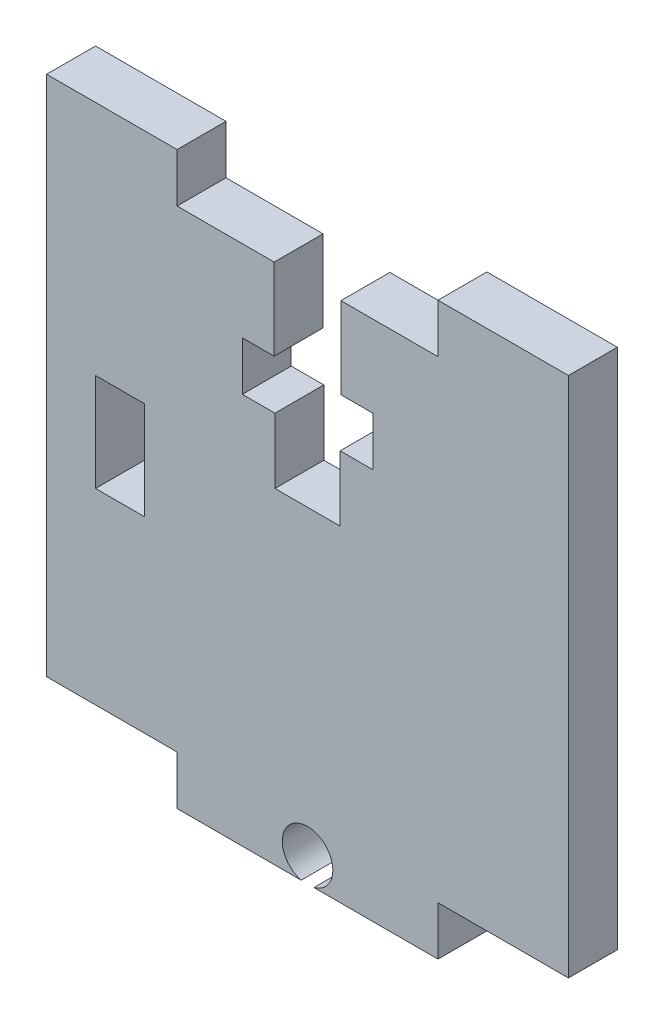
ISO-10303-21;
HEADER;
FILE_DESCRIPTION(('STEP AP214'),'2;1');
FILE_NAME('part.step','',(''),(''),'','','');
FILE_SCHEMA(('AUTOMOTIVE_DESIGN { 1 0 10303 214 1 1 1 1 }'));
ENDSEC;
DATA;
#1=APPLICATION_CONTEXT('core data for automotive mechanical design processes');
#2=APPLICATION_PROTOCOL_DEFINITION('international standard','automotive_design',2000,#1);
#3=PRODUCT_CONTEXT('',#1,'mechanical');
#4=PRODUCT('Part','Part','',(#3));
#5=PRODUCT_RELATED_PRODUCT_CATEGORY('part','',(#4));
#6=PRODUCT_DEFINITION_FORMATION('','',#4);
#7=PRODUCT_DEFINITION_CONTEXT('part definition',#1,'design');
#8=PRODUCT_DEFINITION('design','',#6,#7);
#9=PRODUCT_DEFINITION_SHAPE('','',#8);
#10=(LENGTH_UNIT() NAMED_UNIT(*) SI_UNIT(.MILLI.,.METRE.));
#11=(NAMED_UNIT(*) PLANE_ANGLE_UNIT() SI_UNIT($,.RADIAN.));
#12=(NAMED_UNIT(*) SI_UNIT($,.STERADIAN.) SOLID_ANGLE_UNIT());
#13=UNCERTAINTY_MEASURE_WITH_UNIT(LENGTH_MEASURE(1.E-05),#10,'distance_accuracy_value','');
#14=(GEOMETRIC_REPRESENTATION_CONTEXT(3) GLOBAL_UNCERTAINTY_ASSIGNED_CONTEXT((#13)) GLOBAL_UNIT_ASSIGNED_CONTEXT((#10,
#11,#12)) REPRESENTATION_CONTEXT('',''));
#15=CARTESIAN_POINT('',(0.,0.,0.));
#16=DIRECTION('',(0.,0.,1.));
#17=DIRECTION('',(1.,0.,0.));
#18=AXIS2_PLACEMENT_3D('',#15,#16,#17);
#19=CARTESIAN_POINT('',(0.,18.3553054771042,3.));
#20=DIRECTION('',(0.,0.,1.));
#21=DIRECTION('',(1.,0.,0.));
#22=AXIS2_PLACEMENT_3D('',#19,#20,#21);
#23=PLANE('',#22);
#24=DIRECTION('',(0.,-1.,0.));
#25=VECTOR('',#24,1.);
#26=CARTESIAN_POINT('',(8.,48.8553054771042,3.));
#27=LINE('',#26,#25);
#28=CARTESIAN_POINT('',(8.,51.8553054771042,3.));
#29=VERTEX_POINT('',#28);
#30=CARTESIAN_POINT('',(8.,48.8553054771042,3.));
#31=VERTEX_POINT('',#30);
#32=EDGE_CURVE('E266',#29,#31,#27,.T.);
#33=ORIENTED_EDGE('',*,*,#32,.T.);
#34=DIRECTION('',(-1.,0.,0.));
#35=VECTOR('',#34,1.);
#36=CARTESIAN_POINT('',(2.04789002341845,48.8553054771042,3.));
#37=LINE('',#36,#35);
#38=CARTESIAN_POINT('',(2.04789002341845,48.8553054771042,3.));
#39=VERTEX_POINT('',#38);
#40=EDGE_CURVE('E269',#31,#39,#37,.T.);
#41=ORIENTED_EDGE('',*,*,#40,.T.);
#42=DIRECTION('',(0.,-1.,0.));
#43=VECTOR('',#42,1.);
#44=CARTESIAN_POINT('',(2.04789002341845,48.8553054771042,3.));
#45=LINE('',#44,#43);
#46=CARTESIAN_POINT('',(2.04789002341845,43.8553054771042,3.));
#47=VERTEX_POINT('',#46);
#48=EDGE_CURVE('E272',#39,#47,#45,.T.);
#49=ORIENTED_EDGE('',*,*,#48,.T.);
#50=DIRECTION('',(1.,0.,0.));
#51=VECTOR('',#50,1.);
#52=CARTESIAN_POINT('',(2.04789002341845,43.8553054771042,3.));
#53=LINE('',#52,#51);
#54=CARTESIAN_POINT('',(4.,43.8553054771042,3.));
#55=VERTEX_POINT('',#54);
#56=EDGE_CURVE('E274',#47,#55,#53,.T.);
#57=ORIENTED_EDGE('',*,*,#56,.T.);
#58=DIRECTION('',(0.,-1.,0.));
#59=VECTOR('',#58,1.);
#60=CARTESIAN_POINT('',(4.,43.8553054771042,3.));
#61=LINE('',#60,#59);
#62=CARTESIAN_POINT('',(4.,40.8553054771042,3.));
#63=VERTEX_POINT('',#62);
#64=EDGE_CURVE('E276',#55,#63,#61,.T.);
#65=ORIENTED_EDGE('',*,*,#64,.T.);
#66=DIRECTION('',(-1.,0.,0.));
#67=VECTOR('',#66,1.);
#68=CARTESIAN_POINT('',(4.,40.8553054771042,3.));
#69=LINE('',#68,#67);
#70=CARTESIAN_POINT('',(2.,40.8553054771042,3.));
#71=VERTEX_POINT('',#70);
#72=EDGE_CURVE('E278',#63,#71,#69,.T.);
#73=ORIENTED_EDGE('',*,*,#72,.T.);
#74=DIRECTION('',(0.,-1.,0.));
#75=VECTOR('',#74,1.);
#76=CARTESIAN_POINT('',(2.,40.8553054771042,3.));
#77=LINE('',#76,#75);
#78=CARTESIAN_POINT('',(2.,36.8553054771042,3.));
#79=VERTEX_POINT('',#78);
#80=EDGE_CURVE('E280',#71,#79,#77,.T.);
#81=ORIENTED_EDGE('',*,*,#80,.T.);
#82=DIRECTION('',(-1.,0.,0.));
#83=VECTOR('',#82,1.);
#84=CARTESIAN_POINT('',(2.,36.8553054771042,3.));
#85=LINE('',#84,#83);
#86=CARTESIAN_POINT('',(-2.,36.8553054771042,3.));
#87=VERTEX_POINT('',#86);
#88=EDGE_CURVE('E282',#79,#87,#85,.T.);
#89=ORIENTED_EDGE('',*,*,#88,.T.);
#90=DIRECTION('',(0.,1.,0.));
#91=VECTOR('',#90,1.);
#92=CARTESIAN_POINT('',(-2.,40.8553054771042,3.));
#93=LINE('',#92,#91);
#94=CARTESIAN_POINT('',(-2.,40.8553054771042,3.));
#95=VERTEX_POINT('',#94);
#96=EDGE_CURVE('E284',#87,#95,#93,.T.);
#97=ORIENTED_EDGE('',*,*,#96,.T.);
#98=DIRECTION('',(-1.,0.,0.));
#99=VECTOR('',#98,1.);
#100=CARTESIAN_POINT('',(-4.00000000000001,40.8553054771042,3.));
#101=LINE('',#100,#99);
#102=CARTESIAN_POINT('',(-4.00000000000001,40.8553054771042,3.));
#103=VERTEX_POINT('',#102);
#104=EDGE_CURVE('E286',#95,#103,#101,.T.);
#105=ORIENTED_EDGE('',*,*,#104,.T.);
#106=DIRECTION('',(0.,1.,0.));
#107=VECTOR('',#106,1.);
#108=CARTESIAN_POINT('',(-4.,43.8553054771042,3.));
#109=LINE('',#108,#107);
#110=CARTESIAN_POINT('',(-4.,43.8553054771042,3.));
#111=VERTEX_POINT('',#110);
#112=EDGE_CURVE('E288',#103,#111,#109,.T.);
#113=ORIENTED_EDGE('',*,*,#112,.T.);
#114=DIRECTION('',(1.,0.,0.));
#115=VECTOR('',#114,1.);
#116=CARTESIAN_POINT('',(-2.04789002341846,43.8553054771042,3.));
#117=LINE('',#116,#115);
#118=CARTESIAN_POINT('',(-2.04789002341846,43.8553054771042,3.));
#119=VERTEX_POINT('',#118);
#120=EDGE_CURVE('E290',#111,#119,#117,.T.);
#121=ORIENTED_EDGE('',*,*,#120,.T.);
#122=DIRECTION('',(0.,1.,0.));
#123=VECTOR('',#122,1.);
#124=CARTESIAN_POINT('',(-2.04789002341846,48.8553054771042,3.));
#125=LINE('',#124,#123);
#126=CARTESIAN_POINT('',(-2.04789002341846,48.8553054771042,3.));
#127=VERTEX_POINT('',#126);
#128=EDGE_CURVE('E292',#119,#127,#125,.T.);
#129=ORIENTED_EDGE('',*,*,#128,.T.);
#130=DIRECTION('',(-1.,0.,0.));
#131=VECTOR('',#130,1.);
#132=CARTESIAN_POINT('',(-2.04789002341846,48.8553054771042,3.));
#133=LINE('',#132,#131);
#134=CARTESIAN_POINT('',(-8.00000000000001,48.8553054771042,3.));
#135=VERTEX_POINT('',#134);
#136=EDGE_CURVE('E294',#127,#135,#133,.T.);
#137=ORIENTED_EDGE('',*,*,#136,.T.);
#138=DIRECTION('',(0.,1.,0.));
#139=VECTOR('',#138,1.);
#140=CARTESIAN_POINT('',(-8.00000000000001,48.8553054771042,3.));
#141=LINE('',#140,#139);
#142=CARTESIAN_POINT('',(-8.00000000000001,51.8553054771042,3.));
#143=VERTEX_POINT('',#142);
#144=EDGE_CURVE('E296',#135,#143,#141,.T.);
#145=ORIENTED_EDGE('',*,*,#144,.T.);
#146=DIRECTION('',(-1.,0.,0.));
#147=VECTOR('',#146,1.);
#148=CARTESIAN_POINT('',(-8.00000000000001,51.8553054771042,3.));
#149=LINE('',#148,#147);
#150=CARTESIAN_POINT('',(-16.,51.8553054771042,3.));
#151=VERTEX_POINT('',#150);
#152=EDGE_CURVE('E298',#143,#151,#149,.T.);
#153=ORIENTED_EDGE('',*,*,#152,.T.);
#154=DIRECTION('',(0.,-1.,0.));
#155=VECTOR('',#154,1.);
#156=CARTESIAN_POINT('',(-16.,51.8553054771042,3.));
#157=LINE('',#156,#155);
#158=CARTESIAN_POINT('',(-16.,19.8553054771042,3.));
#159=VERTEX_POINT('',#158);
#160=EDGE_CURVE('E300',#151,#159,#157,.T.);
#161=ORIENTED_EDGE('',*,*,#160,.T.);
#162=DIRECTION('',(1.,0.,0.));
#163=VECTOR('',#162,1.);
#164=CARTESIAN_POINT('',(-16.,19.8553054771042,3.));
#165=LINE('',#164,#163);
#166=CARTESIAN_POINT('',(-8.00000000000001,19.8553054771042,3.));
#167=VERTEX_POINT('',#166);
#168=EDGE_CURVE('E302',#159,#167,#165,.T.);
#169=ORIENTED_EDGE('',*,*,#168,.T.);
#170=DIRECTION('',(0.,-1.,0.));
#171=VECTOR('',#170,1.);
#172=CARTESIAN_POINT('',(-8.00000000000001,16.8553054771042,3.));
#173=LINE('',#172,#171);
#174=CARTESIAN_POINT('',(-8.00000000000001,16.8553054771042,3.));
#175=VERTEX_POINT('',#174);
#176=EDGE_CURVE('E304',#167,#175,#173,.T.);
#177=ORIENTED_EDGE('',*,*,#176,.T.);
#178=DIRECTION('',(1.,0.,0.));
#179=VECTOR('',#178,1.);
#180=CARTESIAN_POINT('',(-8.00000000000001,16.8553054771042,3.));
#181=LINE('',#180,#179);
#182=CARTESIAN_POINT('',(-0.390512483795328,16.8553054771042,3.));
#183=VERTEX_POINT('',#182);
#184=EDGE_CURVE('E306',#175,#183,#181,.T.);
#185=ORIENTED_EDGE('',*,*,#184,.T.);
#186=CARTESIAN_POINT('',(0.,18.3553054771042,3.));
#187=DIRECTION('',(0.,0.,-1.));
#188=DIRECTION('',(1.,0.,0.));
#189=AXIS2_PLACEMENT_3D('',#186,#187,#188);
#190=CIRCLE('',#189,1.55);
#191=CARTESIAN_POINT('',(0.390512483795337,16.8553054771042,3.));
#192=VERTEX_POINT('',#191);
#193=EDGE_CURVE('E308',#183,#192,#190,.T.);
#194=ORIENTED_EDGE('',*,*,#193,.T.);
#195=DIRECTION('',(1.,0.,0.));
#196=VECTOR('',#195,1.);
#197=CARTESIAN_POINT('',(0.390512483795338,16.8553054771042,3.));
#198=LINE('',#197,#196);
#199=CARTESIAN_POINT('',(8.00000000000001,16.8553054771042,3.));
#200=VERTEX_POINT('',#199);
#201=EDGE_CURVE('E310',#192,#200,#198,.T.);
#202=ORIENTED_EDGE('',*,*,#201,.T.);
#203=DIRECTION('',(0.,1.,0.));
#204=VECTOR('',#203,1.);
#205=CARTESIAN_POINT('',(8.00000000000001,16.8553054771042,3.));
#206=LINE('',#205,#204);
#207=CARTESIAN_POINT('',(8.00000000000001,19.8553054771042,3.));
#208=VERTEX_POINT('',#207);
#209=EDGE_CURVE('E312',#200,#208,#206,.T.);
#210=ORIENTED_EDGE('',*,*,#209,.T.);
#211=DIRECTION('',(1.,0.,0.));
#212=VECTOR('',#211,1.);
#213=CARTESIAN_POINT('',(16.,19.8553054771042,3.));
#214=LINE('',#213,#212);
#215=CARTESIAN_POINT('',(16.,19.8553054771042,3.));
#216=VERTEX_POINT('',#215);
#217=EDGE_CURVE('E314',#208,#216,#214,.T.);
#218=ORIENTED_EDGE('',*,*,#217,.T.);
#219=DIRECTION('',(0.,1.,0.));
#220=VECTOR('',#219,1.);
#221=CARTESIAN_POINT('',(16.,51.8553054771042,3.));
#222=LINE('',#221,#220);
#223=CARTESIAN_POINT('',(16.,51.8553054771042,3.));
#224=VERTEX_POINT('',#223);
#225=EDGE_CURVE('E316',#216,#224,#222,.T.);
#226=ORIENTED_EDGE('',*,*,#225,.T.);
#227=DIRECTION('',(-1.,0.,0.));
#228=VECTOR('',#227,1.);
#229=CARTESIAN_POINT('',(8.,51.8553054771042,3.));
#230=LINE('',#229,#228);
#231=EDGE_CURVE('E318',#224,#29,#230,.T.);
#232=ORIENTED_EDGE('',*,*,#231,.T.);
#233=EDGE_LOOP('',(#33,#41,#49,#57,#65,#73,#81,#89,#97,#105,#113,#121,#129,#137,#145,#153,#161,
#169,#177,#185,#194,#202,#210,#218,#226,#232));
#234=FACE_BOUND('',#233,.T.);
#235=DIRECTION('',(1.,0.,0.));
#236=VECTOR('',#235,1.);
#237=CARTESIAN_POINT('',(-13.,31.3553054771042,3.));
#238=LINE('',#237,#236);
#239=CARTESIAN_POINT('',(-13.,31.3553054771042,3.));
#240=VERTEX_POINT('',#239);
#241=CARTESIAN_POINT('',(-9.99999999999999,31.3553054771042,3.));
#242=VERTEX_POINT('',#241);
#243=EDGE_CURVE('E238',#240,#242,#238,.T.);
#244=ORIENTED_EDGE('',*,*,#243,.F.);
#245=DIRECTION('',(0.,-1.,0.));
#246=VECTOR('',#245,1.);
#247=CARTESIAN_POINT('',(-13.,31.3553054771042,3.));
#248=LINE('',#247,#246);
#249=CARTESIAN_POINT('',(-13.,37.3553054771042,3.));
#250=VERTEX_POINT('',#249);
#251=EDGE_CURVE('E230',#250,#240,#248,.T.);
#252=ORIENTED_EDGE('',*,*,#251,.F.);
#253=DIRECTION('',(-1.,0.,0.));
#254=VECTOR('',#253,1.);
#255=CARTESIAN_POINT('',(-13.,37.3553054771042,3.));
#256=LINE('',#255,#254);
#257=CARTESIAN_POINT('',(-9.99999999999999,37.3553054771042,3.));
#258=VERTEX_POINT('',#257);
#259=EDGE_CURVE('E252',#258,#250,#256,.T.);
#260=ORIENTED_EDGE('',*,*,#259,.F.);
#261=DIRECTION('',(0.,1.,0.));
#262=VECTOR('',#261,1.);
#263=CARTESIAN_POINT('',(-9.99999999999999,31.3553054771042,3.));
#264=LINE('',#263,#262);
#265=EDGE_CURVE('E250',#242,#258,#264,.T.);
#266=ORIENTED_EDGE('',*,*,#265,.F.);
#267=EDGE_LOOP('',(#244,#252,#260,#266));
#268=FACE_BOUND('',#267,.T.);
#269=ADVANCED_FACE('F33',(#234,#268),#23,.T.);
#270=CARTESIAN_POINT('',(0.,18.3553054771042,0.));
#271=DIRECTION('',(0.,0.,1.));
#272=DIRECTION('',(1.,0.,0.));
#273=AXIS2_PLACEMENT_3D('',#270,#271,#272);
#274=PLANE('',#273);
#275=DIRECTION('',(0.,-1.,0.));
#276=VECTOR('',#275,1.);
#277=CARTESIAN_POINT('',(8.,48.8553054771042,0.));
#278=LINE('',#277,#276);
#279=CARTESIAN_POINT('',(8.,51.8553054771042,0.));
#280=VERTEX_POINT('',#279);
#281=CARTESIAN_POINT('',(8.,48.8553054771042,0.));
#282=VERTEX_POINT('',#281);
#283=EDGE_CURVE('E246',#280,#282,#278,.T.);
#284=ORIENTED_EDGE('',*,*,#283,.F.);
#285=DIRECTION('',(-1.,0.,0.));
#286=VECTOR('',#285,1.);
#287=CARTESIAN_POINT('',(8.,51.8553054771042,0.));
#288=LINE('',#287,#286);
#289=CARTESIAN_POINT('',(16.,51.8553054771042,0.));
#290=VERTEX_POINT('',#289);
#291=EDGE_CURVE('E270',#290,#280,#288,.T.);
#292=ORIENTED_EDGE('',*,*,#291,.F.);
#293=DIRECTION('',(0.,1.,0.));
#294=VECTOR('',#293,1.);
#295=CARTESIAN_POINT('',(16.,51.8553054771042,0.));
#296=LINE('',#295,#294);
#297=CARTESIAN_POINT('',(16.,19.8553054771042,0.));
#298=VERTEX_POINT('',#297);
#299=EDGE_CURVE('E369',#298,#290,#296,.T.);
#300=ORIENTED_EDGE('',*,*,#299,.F.);
#301=DIRECTION('',(1.,0.,0.));
#302=VECTOR('',#301,1.);
#303=CARTESIAN_POINT('',(16.,19.8553054771042,0.));
#304=LINE('',#303,#302);
#305=CARTESIAN_POINT('',(8.00000000000001,19.8553054771042,0.));
#306=VERTEX_POINT('',#305);
#307=EDGE_CURVE('E367',#306,#298,#304,.T.);
#308=ORIENTED_EDGE('',*,*,#307,.F.);
#309=DIRECTION('',(0.,1.,0.));
#310=VECTOR('',#309,1.);
#311=CARTESIAN_POINT('',(8.00000000000001,16.8553054771042,0.));
#312=LINE('',#311,#310);
#313=CARTESIAN_POINT('',(8.00000000000001,16.8553054771042,0.));
#314=VERTEX_POINT('',#313);
#315=EDGE_CURVE('E365',#314,#306,#312,.T.);
#316=ORIENTED_EDGE('',*,*,#315,.F.);
#317=DIRECTION('',(1.,0.,0.));
#318=VECTOR('',#317,1.);
#319=CARTESIAN_POINT('',(0.390512483795338,16.8553054771042,0.));
#320=LINE('',#319,#318);
#321=CARTESIAN_POINT('',(0.390512483795337,16.8553054771042,0.));
#322=VERTEX_POINT('',#321);
#323=EDGE_CURVE('E363',#322,#314,#320,.T.);
#324=ORIENTED_EDGE('',*,*,#323,.F.);
#325=CARTESIAN_POINT('',(0.,18.3553054771042,0.));
#326=DIRECTION('',(0.,0.,-1.));
#327=DIRECTION('',(1.,0.,0.));
#328=AXIS2_PLACEMENT_3D('',#325,#326,#327);
#329=CIRCLE('',#328,1.55);
#330=CARTESIAN_POINT('',(-0.390512483795328,16.8553054771042,0.));
#331=VERTEX_POINT('',#330);
#332=EDGE_CURVE('E361',#331,#322,#329,.T.);
#333=ORIENTED_EDGE('',*,*,#332,.F.);
#334=DIRECTION('',(1.,0.,0.));
#335=VECTOR('',#334,1.);
#336=CARTESIAN_POINT('',(-8.00000000000001,16.8553054771042,0.));
#337=LINE('',#336,#335);
#338=CARTESIAN_POINT('',(-8.00000000000001,16.8553054771042,0.));
#339=VERTEX_POINT('',#338);
#340=EDGE_CURVE('E359',#339,#331,#337,.T.);
#341=ORIENTED_EDGE('',*,*,#340,.F.);
#342=DIRECTION('',(0.,-1.,0.));
#343=VECTOR('',#342,1.);
#344=CARTESIAN_POINT('',(-8.00000000000001,16.8553054771042,0.));
#345=LINE('',#344,#343);
#346=CARTESIAN_POINT('',(-8.00000000000001,19.8553054771042,0.));
#347=VERTEX_POINT('',#346);
#348=EDGE_CURVE('E357',#347,#339,#345,.T.);
#349=ORIENTED_EDGE('',*,*,#348,.F.);
#350=DIRECTION('',(1.,0.,0.));
#351=VECTOR('',#350,1.);
#352=CARTESIAN_POINT('',(-16.,19.8553054771042,0.));
#353=LINE('',#352,#351);
#354=CARTESIAN_POINT('',(-16.,19.8553054771042,0.));
#355=VERTEX_POINT('',#354);
#356=EDGE_CURVE('E355',#355,#347,#353,.T.);
#357=ORIENTED_EDGE('',*,*,#356,.F.);
#358=DIRECTION('',(0.,-1.,0.));
#359=VECTOR('',#358,1.);
#360=CARTESIAN_POINT('',(-16.,51.8553054771042,0.));
#361=LINE('',#360,#359);
#362=CARTESIAN_POINT('',(-16.,51.8553054771042,0.));
#363=VERTEX_POINT('',#362);
#364=EDGE_CURVE('E353',#363,#355,#361,.T.);
#365=ORIENTED_EDGE('',*,*,#364,.F.);
#366=DIRECTION('',(-1.,0.,0.));
#367=VECTOR('',#366,1.);
#368=CARTESIAN_POINT('',(-8.00000000000001,51.8553054771042,0.));
#369=LINE('',#368,#367);
#370=CARTESIAN_POINT('',(-8.00000000000001,51.8553054771042,0.));
#371=VERTEX_POINT('',#370);
#372=EDGE_CURVE('E351',#371,#363,#369,.T.);
#373=ORIENTED_EDGE('',*,*,#372,.F.);
#374=DIRECTION('',(0.,1.,0.));
#375=VECTOR('',#374,1.);
#376=CARTESIAN_POINT('',(-8.00000000000001,48.8553054771042,0.));
#377=LINE('',#376,#375);
#378=CARTESIAN_POINT('',(-8.00000000000001,48.8553054771042,0.));
#379=VERTEX_POINT('',#378);
#380=EDGE_CURVE('E349',#379,#371,#377,.T.);
#381=ORIENTED_EDGE('',*,*,#380,.F.);
#382=DIRECTION('',(-1.,0.,0.));
#383=VECTOR('',#382,1.);
#384=CARTESIAN_POINT('',(-2.04789002341846,48.8553054771042,0.));
#385=LINE('',#384,#383);
#386=CARTESIAN_POINT('',(-2.04789002341846,48.8553054771042,0.));
#387=VERTEX_POINT('',#386);
#388=EDGE_CURVE('E347',#387,#379,#385,.T.);
#389=ORIENTED_EDGE('',*,*,#388,.F.);
#390=DIRECTION('',(0.,1.,0.));
#391=VECTOR('',#390,1.);
#392=CARTESIAN_POINT('',(-2.04789002341846,48.8553054771042,0.));
#393=LINE('',#392,#391);
#394=CARTESIAN_POINT('',(-2.04789002341846,43.8553054771042,0.));
#395=VERTEX_POINT('',#394);
#396=EDGE_CURVE('E345',#395,#387,#393,.T.);
#397=ORIENTED_EDGE('',*,*,#396,.F.);
#398=DIRECTION('',(1.,0.,0.));
#399=VECTOR('',#398,1.);
#400=CARTESIAN_POINT('',(-2.04789002341846,43.8553054771042,0.));
#401=LINE('',#400,#399);
#402=CARTESIAN_POINT('',(-4.,43.8553054771042,0.));
#403=VERTEX_POINT('',#402);
#404=EDGE_CURVE('E343',#403,#395,#401,.T.);
#405=ORIENTED_EDGE('',*,*,#404,.F.);
#406=DIRECTION('',(0.,1.,0.));
#407=VECTOR('',#406,1.);
#408=CARTESIAN_POINT('',(-4.,43.8553054771042,0.));
#409=LINE('',#408,#407);
#410=CARTESIAN_POINT('',(-4.00000000000001,40.8553054771042,0.));
#411=VERTEX_POINT('',#410);
#412=EDGE_CURVE('E341',#411,#403,#409,.T.);
#413=ORIENTED_EDGE('',*,*,#412,.F.);
#414=DIRECTION('',(-1.,0.,0.));
#415=VECTOR('',#414,1.);
#416=CARTESIAN_POINT('',(-4.00000000000001,40.8553054771042,0.));
#417=LINE('',#416,#415);
#418=CARTESIAN_POINT('',(-2.,40.8553054771042,0.));
#419=VERTEX_POINT('',#418);
#420=EDGE_CURVE('E339',#419,#411,#417,.T.);
#421=ORIENTED_EDGE('',*,*,#420,.F.);
#422=DIRECTION('',(0.,1.,0.));
#423=VECTOR('',#422,1.);
#424=CARTESIAN_POINT('',(-2.,40.8553054771042,0.));
#425=LINE('',#424,#423);
#426=CARTESIAN_POINT('',(-2.,36.8553054771042,0.));
#427=VERTEX_POINT('',#426);
#428=EDGE_CURVE('E337',#427,#419,#425,.T.);
#429=ORIENTED_EDGE('',*,*,#428,.F.);
#430=DIRECTION('',(-1.,0.,0.));
#431=VECTOR('',#430,1.);
#432=CARTESIAN_POINT('',(2.,36.8553054771042,0.));
#433=LINE('',#432,#431);
#434=CARTESIAN_POINT('',(2.,36.8553054771042,0.));
#435=VERTEX_POINT('',#434);
#436=EDGE_CURVE('E335',#435,#427,#433,.T.);
#437=ORIENTED_EDGE('',*,*,#436,.F.);
#438=DIRECTION('',(0.,-1.,0.));
#439=VECTOR('',#438,1.);
#440=CARTESIAN_POINT('',(2.,40.8553054771042,0.));
#441=LINE('',#440,#439);
#442=CARTESIAN_POINT('',(2.,40.8553054771042,0.));
#443=VERTEX_POINT('',#442);
#444=EDGE_CURVE('E333',#443,#435,#441,.T.);
#445=ORIENTED_EDGE('',*,*,#444,.F.);
#446=DIRECTION('',(-1.,0.,0.));
#447=VECTOR('',#446,1.);
#448=CARTESIAN_POINT('',(4.,40.8553054771042,0.));
#449=LINE('',#448,#447);
#450=CARTESIAN_POINT('',(4.,40.8553054771042,0.));
#451=VERTEX_POINT('',#450);
#452=EDGE_CURVE('E331',#451,#443,#449,.T.);
#453=ORIENTED_EDGE('',*,*,#452,.F.);
#454=DIRECTION('',(0.,-1.,0.));
#455=VECTOR('',#454,1.);
#456=CARTESIAN_POINT('',(4.,43.8553054771042,0.));
#457=LINE('',#456,#455);
#458=CARTESIAN_POINT('',(4.,43.8553054771042,0.));
#459=VERTEX_POINT('',#458);
#460=EDGE_CURVE('E329',#459,#451,#457,.T.);
#461=ORIENTED_EDGE('',*,*,#460,.F.);
#462=DIRECTION('',(1.,0.,0.));
#463=VECTOR('',#462,1.);
#464=CARTESIAN_POINT('',(2.04789002341845,43.8553054771042,0.));
#465=LINE('',#464,#463);
#466=CARTESIAN_POINT('',(2.04789002341845,43.8553054771042,0.));
#467=VERTEX_POINT('',#466);
#468=EDGE_CURVE('E327',#467,#459,#465,.T.);
#469=ORIENTED_EDGE('',*,*,#468,.F.);
#470=DIRECTION('',(0.,-1.,0.));
#471=VECTOR('',#470,1.);
#472=CARTESIAN_POINT('',(2.04789002341845,48.8553054771042,0.));
#473=LINE('',#472,#471);
#474=CARTESIAN_POINT('',(2.04789002341845,48.8553054771042,0.));
#475=VERTEX_POINT('',#474);
#476=EDGE_CURVE('E325',#475,#467,#473,.T.);
#477=ORIENTED_EDGE('',*,*,#476,.F.);
#478=DIRECTION('',(-1.,0.,0.));
#479=VECTOR('',#478,1.);
#480=CARTESIAN_POINT('',(2.04789002341845,48.8553054771042,0.));
#481=LINE('',#480,#479);
#482=EDGE_CURVE('E323',#282,#475,#481,.T.);
#483=ORIENTED_EDGE('',*,*,#482,.F.);
#484=EDGE_LOOP('',(#284,#292,#300,#308,#316,#324,#333,#341,#349,#357,#365,#373,#381,#389,#397,
#405,#413,#421,#429,#437,#445,#453,#461,#469,#477,#483));
#485=FACE_BOUND('',#484,.T.);
#486=DIRECTION('',(0.,-1.,0.));
#487=VECTOR('',#486,1.);
#488=CARTESIAN_POINT('',(-13.,31.3553054771042,0.));
#489=LINE('',#488,#487);
#490=CARTESIAN_POINT('',(-13.,37.3553054771042,0.));
#491=VERTEX_POINT('',#490);
#492=CARTESIAN_POINT('',(-13.,31.3553054771042,0.));
#493=VERTEX_POINT('',#492);
#494=EDGE_CURVE('E56',#491,#493,#489,.T.);
#495=ORIENTED_EDGE('',*,*,#494,.T.);
#496=DIRECTION('',(1.,0.,0.));
#497=VECTOR('',#496,1.);
#498=CARTESIAN_POINT('',(-13.,31.3553054771042,0.));
#499=LINE('',#498,#497);
#500=CARTESIAN_POINT('',(-9.99999999999999,31.3553054771042,0.));
#501=VERTEX_POINT('',#500);
#502=EDGE_CURVE('E245',#493,#501,#499,.T.);
#503=ORIENTED_EDGE('',*,*,#502,.T.);
#504=DIRECTION('',(0.,1.,0.));
#505=VECTOR('',#504,1.);
#506=CARTESIAN_POINT('',(-9.99999999999999,31.3553054771042,0.));
#507=LINE('',#506,#505);
#508=CARTESIAN_POINT('',(-9.99999999999999,37.3553054771042,0.));
#509=VERTEX_POINT('',#508);
#510=EDGE_CURVE('E258',#501,#509,#507,.T.);
#511=ORIENTED_EDGE('',*,*,#510,.T.);
#512=DIRECTION('',(-1.,0.,0.));
#513=VECTOR('',#512,1.);
#514=CARTESIAN_POINT('',(-13.,37.3553054771042,0.));
#515=LINE('',#514,#513);
#516=EDGE_CURVE('E239',#509,#491,#515,.T.);
#517=ORIENTED_EDGE('',*,*,#516,.T.);
#518=EDGE_LOOP('',(#495,#503,#511,#517));
#519=FACE_BOUND('',#518,.T.);
#520=ADVANCED_FACE('F453',(#485,#519),#274,.F.);
#521=CARTESIAN_POINT('',(8.,48.8553054771042,3.));
#522=DIRECTION('',(1.,0.,0.));
#523=DIRECTION('',(0.,0.,-1.));
#524=AXIS2_PLACEMENT_3D('',#521,#522,#523);
#525=PLANE('',#524);
#526=ORIENTED_EDGE('',*,*,#283,.T.);
#527=DIRECTION('',(0.,0.,-1.));
#528=VECTOR('',#527,1.);
#529=CARTESIAN_POINT('',(8.,48.8553054771042,3.));
#530=LINE('',#529,#528);
#531=EDGE_CURVE('E11',#31,#282,#530,.T.);
#532=ORIENTED_EDGE('',*,*,#531,.F.);
#533=ORIENTED_EDGE('',*,*,#32,.F.);
#534=DIRECTION('',(0.,0.,-1.));
#535=VECTOR('',#534,1.);
#536=CARTESIAN_POINT('',(8.,51.8553054771042,3.));
#537=LINE('',#536,#535);
#538=EDGE_CURVE('E320',#29,#280,#537,.T.);
#539=ORIENTED_EDGE('',*,*,#538,.T.);
#540=EDGE_LOOP('',(#526,#532,#533,#539));
#541=FACE_BOUND('',#540,.T.);
#542=ADVANCED_FACE('F35',(#541),#525,.F.);
#543=CARTESIAN_POINT('',(2.04789002341845,48.8553054771042,3.));
#544=DIRECTION('',(0.,-1.,0.));
#545=DIRECTION('',(0.,0.,-1.));
#546=AXIS2_PLACEMENT_3D('',#543,#544,#545);
#547=PLANE('',#546);
#548=ORIENTED_EDGE('',*,*,#482,.T.);
#549=DIRECTION('',(0.,0.,-1.));
#550=VECTOR('',#549,1.);
#551=CARTESIAN_POINT('',(2.04789002341845,48.8553054771042,3.));
#552=LINE('',#551,#550);
#553=EDGE_CURVE('E41',#39,#475,#552,.T.);
#554=ORIENTED_EDGE('',*,*,#553,.F.);
#555=ORIENTED_EDGE('',*,*,#40,.F.);
#556=ORIENTED_EDGE('',*,*,#531,.T.);
#557=EDGE_LOOP('',(#548,#554,#555,#556));
#558=FACE_BOUND('',#557,.T.);
#559=ADVANCED_FACE('F470',(#558),#547,.F.);
#560=CARTESIAN_POINT('',(2.04789002341845,48.8553054771042,3.));
#561=DIRECTION('',(1.,0.,0.));
#562=DIRECTION('',(0.,1.,0.));
#563=AXIS2_PLACEMENT_3D('',#560,#561,#562);
#564=PLANE('',#563);
#565=ORIENTED_EDGE('',*,*,#476,.T.);
#566=DIRECTION('',(0.,0.,-1.));
#567=VECTOR('',#566,1.);
#568=CARTESIAN_POINT('',(2.04789002341845,43.8553054771042,3.));
#569=LINE('',#568,#567);
#570=EDGE_CURVE('E440',#47,#467,#569,.T.);
#571=ORIENTED_EDGE('',*,*,#570,.F.);
#572=ORIENTED_EDGE('',*,*,#48,.F.);
#573=ORIENTED_EDGE('',*,*,#553,.T.);
#574=EDGE_LOOP('',(#565,#571,#572,#573));
#575=FACE_BOUND('',#574,.T.);
#576=ADVANCED_FACE('F447',(#575),#564,.F.);
#577=CARTESIAN_POINT('',(2.04789002341845,43.8553054771042,3.));
#578=DIRECTION('',(0.,1.,0.));
#579=DIRECTION('',(-1.,0.,0.));
#580=AXIS2_PLACEMENT_3D('',#577,#578,#579);
#581=PLANE('',#580);
#582=ORIENTED_EDGE('',*,*,#468,.T.);
#583=DIRECTION('',(0.,0.,-1.));
#584=VECTOR('',#583,1.);
#585=CARTESIAN_POINT('',(4.,43.8553054771042,3.));
#586=LINE('',#585,#584);
#587=EDGE_CURVE('E437',#55,#459,#586,.T.);
#588=ORIENTED_EDGE('',*,*,#587,.F.);
#589=ORIENTED_EDGE('',*,*,#56,.F.);
#590=ORIENTED_EDGE('',*,*,#570,.T.);
#591=EDGE_LOOP('',(#582,#588,#589,#590));
#592=FACE_BOUND('',#591,.T.);
#593=ADVANCED_FACE('F459',(#592),#581,.F.);
#594=CARTESIAN_POINT('',(4.,43.8553054771042,3.));
#595=DIRECTION('',(1.,0.,0.));
#596=DIRECTION('',(0.,1.,0.));
#597=AXIS2_PLACEMENT_3D('',#594,#595,#596);
#598=PLANE('',#597);
#599=ORIENTED_EDGE('',*,*,#460,.T.);
#600=DIRECTION('',(0.,0.,-1.));
#601=VECTOR('',#600,1.);
#602=CARTESIAN_POINT('',(4.,40.8553054771042,3.));
#603=LINE('',#602,#601);
#604=EDGE_CURVE('E434',#63,#451,#603,.T.);
#605=ORIENTED_EDGE('',*,*,#604,.F.);
#606=ORIENTED_EDGE('',*,*,#64,.F.);
#607=ORIENTED_EDGE('',*,*,#587,.T.);
#608=EDGE_LOOP('',(#599,#605,#606,#607));
#609=FACE_BOUND('',#608,.T.);
#610=ADVANCED_FACE('F463',(#609),#598,.F.);
#611=CARTESIAN_POINT('',(4.,40.8553054771042,3.));
#612=DIRECTION('',(0.,-1.,0.));
#613=DIRECTION('',(0.,0.,-1.));
#614=AXIS2_PLACEMENT_3D('',#611,#612,#613);
#615=PLANE('',#614);
#616=ORIENTED_EDGE('',*,*,#452,.T.);
#617=DIRECTION('',(0.,0.,-1.));
#618=VECTOR('',#617,1.);
#619=CARTESIAN_POINT('',(2.,40.8553054771042,3.));
#620=LINE('',#619,#618);
#621=EDGE_CURVE('E431',#71,#443,#620,.T.);
#622=ORIENTED_EDGE('',*,*,#621,.F.);
#623=ORIENTED_EDGE('',*,*,#72,.F.);
#624=ORIENTED_EDGE('',*,*,#604,.T.);
#625=EDGE_LOOP('',(#616,#622,#623,#624));
#626=FACE_BOUND('',#625,.T.);
#627=ADVANCED_FACE('F573',(#626),#615,.F.);
#628=CARTESIAN_POINT('',(2.,40.8553054771042,3.));
#629=DIRECTION('',(1.,0.,0.));
#630=DIRECTION('',(0.,1.,0.));
#631=AXIS2_PLACEMENT_3D('',#628,#629,#630);
#632=PLANE('',#631);
#633=ORIENTED_EDGE('',*,*,#444,.T.);
#634=DIRECTION('',(0.,0.,-1.));
#635=VECTOR('',#634,1.);
#636=CARTESIAN_POINT('',(2.,36.8553054771042,3.));
#637=LINE('',#636,#635);
#638=EDGE_CURVE('E428',#79,#435,#637,.T.);
#639=ORIENTED_EDGE('',*,*,#638,.F.);
#640=ORIENTED_EDGE('',*,*,#80,.F.);
#641=ORIENTED_EDGE('',*,*,#621,.T.);
#642=EDGE_LOOP('',(#633,#639,#640,#641));
#643=FACE_BOUND('',#642,.T.);
#644=ADVANCED_FACE('F571',(#643),#632,.F.);
#645=CARTESIAN_POINT('',(2.,36.8553054771042,3.));
#646=DIRECTION('',(0.,-1.,0.));
#647=DIRECTION('',(0.,0.,-1.));
#648=AXIS2_PLACEMENT_3D('',#645,#646,#647);
#649=PLANE('',#648);
#650=ORIENTED_EDGE('',*,*,#436,.T.);
#651=DIRECTION('',(0.,0.,-1.));
#652=VECTOR('',#651,1.);
#653=CARTESIAN_POINT('',(-2.,36.8553054771042,3.));
#654=LINE('',#653,#652);
#655=EDGE_CURVE('E425',#87,#427,#654,.T.);
#656=ORIENTED_EDGE('',*,*,#655,.F.);
#657=ORIENTED_EDGE('',*,*,#88,.F.);
#658=ORIENTED_EDGE('',*,*,#638,.T.);
#659=EDGE_LOOP('',(#650,#656,#657,#658));
#660=FACE_BOUND('',#659,.T.);
#661=ADVANCED_FACE('F566',(#660),#649,.F.);
#662=CARTESIAN_POINT('',(-2.,40.8553054771042,3.));
#663=DIRECTION('',(-1.,0.,0.));
#664=DIRECTION('',(0.,-1.,0.));
#665=AXIS2_PLACEMENT_3D('',#662,#663,#664);
#666=PLANE('',#665);
#667=ORIENTED_EDGE('',*,*,#428,.T.);
#668=DIRECTION('',(0.,0.,-1.));
#669=VECTOR('',#668,1.);
#670=CARTESIAN_POINT('',(-2.,40.8553054771042,3.));
#671=LINE('',#670,#669);
#672=EDGE_CURVE('E422',#95,#419,#671,.T.);
#673=ORIENTED_EDGE('',*,*,#672,.F.);
#674=ORIENTED_EDGE('',*,*,#96,.F.);
#675=ORIENTED_EDGE('',*,*,#655,.T.);
#676=EDGE_LOOP('',(#667,#673,#674,#675));
#677=FACE_BOUND('',#676,.T.);
#678=ADVANCED_FACE('F561',(#677),#666,.F.);
#679=CARTESIAN_POINT('',(-4.00000000000001,40.8553054771042,3.));
#680=DIRECTION('',(0.,-1.,0.));
#681=DIRECTION('',(0.,0.,-1.));
#682=AXIS2_PLACEMENT_3D('',#679,#680,#681);
#683=PLANE('',#682);
#684=ORIENTED_EDGE('',*,*,#420,.T.);
#685=DIRECTION('',(0.,0.,-1.));
#686=VECTOR('',#685,1.);
#687=CARTESIAN_POINT('',(-4.00000000000001,40.8553054771042,3.));
#688=LINE('',#687,#686);
#689=EDGE_CURVE('E419',#103,#411,#688,.T.);
#690=ORIENTED_EDGE('',*,*,#689,.F.);
#691=ORIENTED_EDGE('',*,*,#104,.F.);
#692=ORIENTED_EDGE('',*,*,#672,.T.);
#693=EDGE_LOOP('',(#684,#690,#691,#692));
#694=FACE_BOUND('',#693,.T.);
#695=ADVANCED_FACE('F557',(#694),#683,.F.);
#696=CARTESIAN_POINT('',(-4.,43.8553054771042,3.));
#697=DIRECTION('',(-1.,0.,0.));
#698=DIRECTION('',(0.,-1.,0.));
#699=AXIS2_PLACEMENT_3D('',#696,#697,#698);
#700=PLANE('',#699);
#701=ORIENTED_EDGE('',*,*,#412,.T.);
#702=DIRECTION('',(0.,0.,-1.));
#703=VECTOR('',#702,1.);
#704=CARTESIAN_POINT('',(-4.,43.8553054771042,3.));
#705=LINE('',#704,#703);
#706=EDGE_CURVE('E416',#111,#403,#705,.T.);
#707=ORIENTED_EDGE('',*,*,#706,.F.);
#708=ORIENTED_EDGE('',*,*,#112,.F.);
#709=ORIENTED_EDGE('',*,*,#689,.T.);
#710=EDGE_LOOP('',(#701,#707,#708,#709));
#711=FACE_BOUND('',#710,.T.);
#712=ADVANCED_FACE('F552',(#711),#700,.F.);
#713=CARTESIAN_POINT('',(-2.04789002341846,43.8553054771042,3.));
#714=DIRECTION('',(0.,1.,0.));
#715=DIRECTION('',(-1.,0.,0.));
#716=AXIS2_PLACEMENT_3D('',#713,#714,#715);
#717=PLANE('',#716);
#718=ORIENTED_EDGE('',*,*,#404,.T.);
#719=DIRECTION('',(0.,0.,-1.));
#720=VECTOR('',#719,1.);
#721=CARTESIAN_POINT('',(-2.04789002341846,43.8553054771042,3.));
#722=LINE('',#721,#720);
#723=EDGE_CURVE('E413',#119,#395,#722,.T.);
#724=ORIENTED_EDGE('',*,*,#723,.F.);
#725=ORIENTED_EDGE('',*,*,#120,.F.);
#726=ORIENTED_EDGE('',*,*,#706,.T.);
#727=EDGE_LOOP('',(#718,#724,#725,#726));
#728=FACE_BOUND('',#727,.T.);
#729=ADVANCED_FACE('F546',(#728),#717,.F.);
#730=CARTESIAN_POINT('',(-2.04789002341846,48.8553054771042,3.));
#731=DIRECTION('',(-1.,0.,0.));
#732=DIRECTION('',(0.,-1.,0.));
#733=AXIS2_PLACEMENT_3D('',#730,#731,#732);
#734=PLANE('',#733);
#735=ORIENTED_EDGE('',*,*,#396,.T.);
#736=DIRECTION('',(0.,0.,-1.));
#737=VECTOR('',#736,1.);
#738=CARTESIAN_POINT('',(-2.04789002341846,48.8553054771042,3.));
#739=LINE('',#738,#737);
#740=EDGE_CURVE('E410',#127,#387,#739,.T.);
#741=ORIENTED_EDGE('',*,*,#740,.F.);
#742=ORIENTED_EDGE('',*,*,#128,.F.);
#743=ORIENTED_EDGE('',*,*,#723,.T.);
#744=EDGE_LOOP('',(#735,#741,#742,#743));
#745=FACE_BOUND('',#744,.T.);
#746=ADVANCED_FACE('F542',(#745),#734,.F.);
#747=CARTESIAN_POINT('',(-2.04789002341846,48.8553054771042,3.));
#748=DIRECTION('',(0.,-1.,0.));
#749=DIRECTION('',(0.,0.,-1.));
#750=AXIS2_PLACEMENT_3D('',#747,#748,#749);
#751=PLANE('',#750);
#752=ORIENTED_EDGE('',*,*,#388,.T.);
#753=DIRECTION('',(0.,0.,-1.));
#754=VECTOR('',#753,1.);
#755=CARTESIAN_POINT('',(-8.00000000000001,48.8553054771042,3.));
#756=LINE('',#755,#754);
#757=EDGE_CURVE('E407',#135,#379,#756,.T.);
#758=ORIENTED_EDGE('',*,*,#757,.F.);
#759=ORIENTED_EDGE('',*,*,#136,.F.);
#760=ORIENTED_EDGE('',*,*,#740,.T.);
#761=EDGE_LOOP('',(#752,#758,#759,#760));
#762=FACE_BOUND('',#761,.T.);
#763=ADVANCED_FACE('F537',(#762),#751,.F.);
#764=CARTESIAN_POINT('',(-8.00000000000001,48.8553054771042,3.));
#765=DIRECTION('',(-1.,0.,0.));
#766=DIRECTION('',(0.,0.,1.));
#767=AXIS2_PLACEMENT_3D('',#764,#765,#766);
#768=PLANE('',#767);
#769=ORIENTED_EDGE('',*,*,#380,.T.);
#770=DIRECTION('',(0.,0.,-1.));
#771=VECTOR('',#770,1.);
#772=CARTESIAN_POINT('',(-8.00000000000001,51.8553054771042,3.));
#773=LINE('',#772,#771);
#774=EDGE_CURVE('E404',#143,#371,#773,.T.);
#775=ORIENTED_EDGE('',*,*,#774,.F.);
#776=ORIENTED_EDGE('',*,*,#144,.F.);
#777=ORIENTED_EDGE('',*,*,#757,.T.);
#778=EDGE_LOOP('',(#769,#775,#776,#777));
#779=FACE_BOUND('',#778,.T.);
#780=ADVANCED_FACE('F531',(#779),#768,.F.);
#781=CARTESIAN_POINT('',(-8.00000000000001,51.8553054771042,3.));
#782=DIRECTION('',(0.,-1.,0.));
#783=DIRECTION('',(0.,0.,-1.));
#784=AXIS2_PLACEMENT_3D('',#781,#782,#783);
#785=PLANE('',#784);
#786=ORIENTED_EDGE('',*,*,#372,.T.);
#787=DIRECTION('',(0.,0.,-1.));
#788=VECTOR('',#787,1.);
#789=CARTESIAN_POINT('',(-16.,51.8553054771042,3.));
#790=LINE('',#789,#788);
#791=EDGE_CURVE('E401',#151,#363,#790,.T.);
#792=ORIENTED_EDGE('',*,*,#791,.F.);
#793=ORIENTED_EDGE('',*,*,#152,.F.);
#794=ORIENTED_EDGE('',*,*,#774,.T.);
#795=EDGE_LOOP('',(#786,#792,#793,#794));
#796=FACE_BOUND('',#795,.T.);
#797=ADVANCED_FACE('F527',(#796),#785,.F.);
#798=CARTESIAN_POINT('',(-16.,51.8553054771042,3.));
#799=DIRECTION('',(1.,0.,0.));
#800=DIRECTION('',(0.,0.,-1.));
#801=AXIS2_PLACEMENT_3D('',#798,#799,#800);
#802=PLANE('',#801);
#803=ORIENTED_EDGE('',*,*,#364,.T.);
#804=DIRECTION('',(0.,0.,-1.));
#805=VECTOR('',#804,1.);
#806=CARTESIAN_POINT('',(-16.,19.8553054771042,3.));
#807=LINE('',#806,#805);
#808=EDGE_CURVE('E398',#159,#355,#807,.T.);
#809=ORIENTED_EDGE('',*,*,#808,.F.);
#810=ORIENTED_EDGE('',*,*,#160,.F.);
#811=ORIENTED_EDGE('',*,*,#791,.T.);
#812=EDGE_LOOP('',(#803,#809,#810,#811));
#813=FACE_BOUND('',#812,.T.);
#814=ADVANCED_FACE('F522',(#813),#802,.F.);
#815=CARTESIAN_POINT('',(-16.,19.8553054771042,3.));
#816=DIRECTION('',(0.,1.,0.));
#817=DIRECTION('',(0.,0.,1.));
#818=AXIS2_PLACEMENT_3D('',#815,#816,#817);
#819=PLANE('',#818);
#820=ORIENTED_EDGE('',*,*,#356,.T.);
#821=DIRECTION('',(0.,0.,-1.));
#822=VECTOR('',#821,1.);
#823=CARTESIAN_POINT('',(-8.00000000000001,19.8553054771042,3.));
#824=LINE('',#823,#822);
#825=EDGE_CURVE('E395',#167,#347,#824,.T.);
#826=ORIENTED_EDGE('',*,*,#825,.F.);
#827=ORIENTED_EDGE('',*,*,#168,.F.);
#828=ORIENTED_EDGE('',*,*,#808,.T.);
#829=EDGE_LOOP('',(#820,#826,#827,#828));
#830=FACE_BOUND('',#829,.T.);
#831=ADVANCED_FACE('F516',(#830),#819,.F.);
#832=CARTESIAN_POINT('',(-8.00000000000001,16.8553054771042,3.));
#833=DIRECTION('',(1.,0.,0.));
#834=DIRECTION('',(0.,0.,-1.));
#835=AXIS2_PLACEMENT_3D('',#832,#833,#834);
#836=PLANE('',#835);
#837=ORIENTED_EDGE('',*,*,#348,.T.);
#838=DIRECTION('',(0.,0.,-1.));
#839=VECTOR('',#838,1.);
#840=CARTESIAN_POINT('',(-8.00000000000001,16.8553054771042,3.));
#841=LINE('',#840,#839);
#842=EDGE_CURVE('E392',#175,#339,#841,.T.);
#843=ORIENTED_EDGE('',*,*,#842,.F.);
#844=ORIENTED_EDGE('',*,*,#176,.F.);
#845=ORIENTED_EDGE('',*,*,#825,.T.);
#846=EDGE_LOOP('',(#837,#843,#844,#845));
#847=FACE_BOUND('',#846,.T.);
#848=ADVANCED_FACE('F512',(#847),#836,.F.);
#849=CARTESIAN_POINT('',(-8.00000000000001,16.8553054771042,3.));
#850=DIRECTION('',(0.,1.,0.));
#851=DIRECTION('',(-1.,0.,0.));
#852=AXIS2_PLACEMENT_3D('',#849,#850,#851);
#853=PLANE('',#852);
#854=ORIENTED_EDGE('',*,*,#340,.T.);
#855=DIRECTION('',(0.,0.,-1.));
#856=VECTOR('',#855,1.);
#857=CARTESIAN_POINT('',(-0.390512483795328,16.8553054771042,3.));
#858=LINE('',#857,#856);
#859=EDGE_CURVE('E389',#183,#331,#858,.T.);
#860=ORIENTED_EDGE('',*,*,#859,.F.);
#861=ORIENTED_EDGE('',*,*,#184,.F.);
#862=ORIENTED_EDGE('',*,*,#842,.T.);
#863=EDGE_LOOP('',(#854,#860,#861,#862));
#864=FACE_BOUND('',#863,.T.);
#865=ADVANCED_FACE('F507',(#864),#853,.F.);
#866=CARTESIAN_POINT('',(0.,18.3553054771042,3.));
#867=DIRECTION('',(0.,0.,-1.));
#868=DIRECTION('',(-1.,0.,0.));
#869=AXIS2_PLACEMENT_3D('',#866,#867,#868);
#870=CYLINDRICAL_SURFACE('',#869,1.55);
#871=ORIENTED_EDGE('',*,*,#332,.T.);
#872=DIRECTION('',(0.,0.,-1.));
#873=VECTOR('',#872,1.);
#874=CARTESIAN_POINT('',(0.390512483795337,16.8553054771042,3.));
#875=LINE('',#874,#873);
#876=EDGE_CURVE('E386',#192,#322,#875,.T.);
#877=ORIENTED_EDGE('',*,*,#876,.F.);
#878=ORIENTED_EDGE('',*,*,#193,.F.);
#879=ORIENTED_EDGE('',*,*,#859,.T.);
#880=EDGE_LOOP('',(#871,#877,#878,#879));
#881=FACE_BOUND('',#880,.T.);
#882=ADVANCED_FACE('F501',(#881),#870,.F.);
#883=CARTESIAN_POINT('',(0.390512483795338,16.8553054771042,3.));
#884=DIRECTION('',(0.,1.,0.));
#885=DIRECTION('',(0.,0.,1.));
#886=AXIS2_PLACEMENT_3D('',#883,#884,#885);
#887=PLANE('',#886);
#888=ORIENTED_EDGE('',*,*,#323,.T.);
#889=DIRECTION('',(0.,0.,-1.));
#890=VECTOR('',#889,1.);
#891=CARTESIAN_POINT('',(8.00000000000001,16.8553054771042,3.));
#892=LINE('',#891,#890);
#893=EDGE_CURVE('E383',#200,#314,#892,.T.);
#894=ORIENTED_EDGE('',*,*,#893,.F.);
#895=ORIENTED_EDGE('',*,*,#201,.F.);
#896=ORIENTED_EDGE('',*,*,#876,.T.);
#897=EDGE_LOOP('',(#888,#894,#895,#896));
#898=FACE_BOUND('',#897,.T.);
#899=ADVANCED_FACE('F497',(#898),#887,.F.);
#900=CARTESIAN_POINT('',(8.00000000000001,16.8553054771042,3.));
#901=DIRECTION('',(-1.,0.,0.));
#902=DIRECTION('',(0.,0.,1.));
#903=AXIS2_PLACEMENT_3D('',#900,#901,#902);
#904=PLANE('',#903);
#905=ORIENTED_EDGE('',*,*,#315,.T.);
#906=DIRECTION('',(0.,0.,-1.));
#907=VECTOR('',#906,1.);
#908=CARTESIAN_POINT('',(8.00000000000001,19.8553054771042,3.));
#909=LINE('',#908,#907);
#910=EDGE_CURVE('E380',#208,#306,#909,.T.);
#911=ORIENTED_EDGE('',*,*,#910,.F.);
#912=ORIENTED_EDGE('',*,*,#209,.F.);
#913=ORIENTED_EDGE('',*,*,#893,.T.);
#914=EDGE_LOOP('',(#905,#911,#912,#913));
#915=FACE_BOUND('',#914,.T.);
#916=ADVANCED_FACE('F492',(#915),#904,.F.);
#917=CARTESIAN_POINT('',(16.,19.8553054771042,3.));
#918=DIRECTION('',(0.,1.,0.));
#919=DIRECTION('',(0.,0.,1.));
#920=AXIS2_PLACEMENT_3D('',#917,#918,#919);
#921=PLANE('',#920);
#922=ORIENTED_EDGE('',*,*,#307,.T.);
#923=DIRECTION('',(0.,0.,-1.));
#924=VECTOR('',#923,1.);
#925=CARTESIAN_POINT('',(16.,19.8553054771042,3.));
#926=LINE('',#925,#924);
#927=EDGE_CURVE('E377',#216,#298,#926,.T.);
#928=ORIENTED_EDGE('',*,*,#927,.F.);
#929=ORIENTED_EDGE('',*,*,#217,.F.);
#930=ORIENTED_EDGE('',*,*,#910,.T.);
#931=EDGE_LOOP('',(#922,#928,#929,#930));
#932=FACE_BOUND('',#931,.T.);
#933=ADVANCED_FACE('F486',(#932),#921,.F.);
#934=CARTESIAN_POINT('',(16.,51.8553054771042,3.));
#935=DIRECTION('',(-1.,0.,0.));
#936=DIRECTION('',(0.,0.,1.));
#937=AXIS2_PLACEMENT_3D('',#934,#935,#936);
#938=PLANE('',#937);
#939=ORIENTED_EDGE('',*,*,#299,.T.);
#940=DIRECTION('',(0.,0.,-1.));
#941=VECTOR('',#940,1.);
#942=CARTESIAN_POINT('',(16.,51.8553054771042,3.));
#943=LINE('',#942,#941);
#944=EDGE_CURVE('E374',#224,#290,#943,.T.);
#945=ORIENTED_EDGE('',*,*,#944,.F.);
#946=ORIENTED_EDGE('',*,*,#225,.F.);
#947=ORIENTED_EDGE('',*,*,#927,.T.);
#948=EDGE_LOOP('',(#939,#945,#946,#947));
#949=FACE_BOUND('',#948,.T.);
#950=ADVANCED_FACE('F482',(#949),#938,.F.);
#951=CARTESIAN_POINT('',(8.,51.8553054771042,3.));
#952=DIRECTION('',(0.,-1.,0.));
#953=DIRECTION('',(0.,0.,-1.));
#954=AXIS2_PLACEMENT_3D('',#951,#952,#953);
#955=PLANE('',#954);
#956=ORIENTED_EDGE('',*,*,#291,.T.);
#957=ORIENTED_EDGE('',*,*,#538,.F.);
#958=ORIENTED_EDGE('',*,*,#231,.F.);
#959=ORIENTED_EDGE('',*,*,#944,.T.);
#960=EDGE_LOOP('',(#956,#957,#958,#959));
#961=FACE_BOUND('',#960,.T.);
#962=ADVANCED_FACE('F477',(#961),#955,.F.);
#963=CARTESIAN_POINT('',(-13.,31.3553054771042,3.));
#964=DIRECTION('',(1.,0.,0.));
#965=DIRECTION('',(0.,0.,-1.));
#966=AXIS2_PLACEMENT_3D('',#963,#964,#965);
#967=PLANE('',#966);
#968=ORIENTED_EDGE('',*,*,#494,.F.);
#969=DIRECTION('',(0.,0.,-1.));
#970=VECTOR('',#969,1.);
#971=CARTESIAN_POINT('',(-13.,37.3553054771042,3.));
#972=LINE('',#971,#970);
#973=EDGE_CURVE('E234',#250,#491,#972,.T.);
#974=ORIENTED_EDGE('',*,*,#973,.F.);
#975=ORIENTED_EDGE('',*,*,#251,.T.);
#976=DIRECTION('',(0.,0.,-1.));
#977=VECTOR('',#976,1.);
#978=CARTESIAN_POINT('',(-13.,31.3553054771042,3.));
#979=LINE('',#978,#977);
#980=EDGE_CURVE('E233',#240,#493,#979,.T.);
#981=ORIENTED_EDGE('',*,*,#980,.T.);
#982=EDGE_LOOP('',(#968,#974,#975,#981));
#983=FACE_BOUND('',#982,.T.);
#984=ADVANCED_FACE('F232',(#983),#967,.T.);
#985=CARTESIAN_POINT('',(-13.,31.3553054771042,3.));
#986=DIRECTION('',(0.,1.,0.));
#987=DIRECTION('',(0.,0.,1.));
#988=AXIS2_PLACEMENT_3D('',#985,#986,#987);
#989=PLANE('',#988);
#990=ORIENTED_EDGE('',*,*,#502,.F.);
#991=ORIENTED_EDGE('',*,*,#980,.F.);
#992=ORIENTED_EDGE('',*,*,#243,.T.);
#993=DIRECTION('',(0.,0.,-1.));
#994=VECTOR('',#993,1.);
#995=CARTESIAN_POINT('',(-9.99999999999999,31.3553054771042,3.));
#996=LINE('',#995,#994);
#997=EDGE_CURVE('E247',#242,#501,#996,.T.);
#998=ORIENTED_EDGE('',*,*,#997,.T.);
#999=EDGE_LOOP('',(#990,#991,#992,#998));
#1000=FACE_BOUND('',#999,.T.);
#1001=ADVANCED_FACE('F242',(#1000),#989,.T.);
#1002=CARTESIAN_POINT('',(-9.99999999999999,31.3553054771042,3.));
#1003=DIRECTION('',(-1.,0.,0.));
#1004=DIRECTION('',(0.,0.,1.));
#1005=AXIS2_PLACEMENT_3D('',#1002,#1003,#1004);
#1006=PLANE('',#1005);
#1007=ORIENTED_EDGE('',*,*,#510,.F.);
#1008=ORIENTED_EDGE('',*,*,#997,.F.);
#1009=ORIENTED_EDGE('',*,*,#265,.T.);
#1010=DIRECTION('',(0.,0.,-1.));
#1011=VECTOR('',#1010,1.);
#1012=CARTESIAN_POINT('',(-9.99999999999999,37.3553054771042,3.));
#1013=LINE('',#1012,#1011);
#1014=EDGE_CURVE('E48',#258,#509,#1013,.T.);
#1015=ORIENTED_EDGE('',*,*,#1014,.T.);
#1016=EDGE_LOOP('',(#1007,#1008,#1009,#1015));
#1017=FACE_BOUND('',#1016,.T.);
#1018=ADVANCED_FACE('F715',(#1017),#1006,.T.);
#1019=CARTESIAN_POINT('',(-13.,37.3553054771042,3.));
#1020=DIRECTION('',(0.,-1.,0.));
#1021=DIRECTION('',(0.,0.,-1.));
#1022=AXIS2_PLACEMENT_3D('',#1019,#1020,#1021);
#1023=PLANE('',#1022);
#1024=ORIENTED_EDGE('',*,*,#516,.F.);
#1025=ORIENTED_EDGE('',*,*,#1014,.F.);
#1026=ORIENTED_EDGE('',*,*,#259,.T.);
#1027=ORIENTED_EDGE('',*,*,#973,.T.);
#1028=EDGE_LOOP('',(#1024,#1025,#1026,#1027));
#1029=FACE_BOUND('',#1028,.T.);
#1030=ADVANCED_FACE('F721',(#1029),#1023,.T.);
#1031=CLOSED_SHELL('',(#269,#520,#542,#559,#576,#593,#610,#627,#644,#661,#678,#695,#712,#729,
#746,#763,#780,#797,#814,#831,#848,#865,#882,#899,#916,#933,#950,#962,#984,#1001,#1018,#1030));
#1032=MANIFOLD_SOLID_BREP('B2',#1031);
#1033=ADVANCED_BREP_SHAPE_REPRESENTATION('',(#18,#1032),#14);
#1034=SHAPE_DEFINITION_REPRESENTATION(#9,#1033);
ENDSEC;
END-ISO-10303-21;
